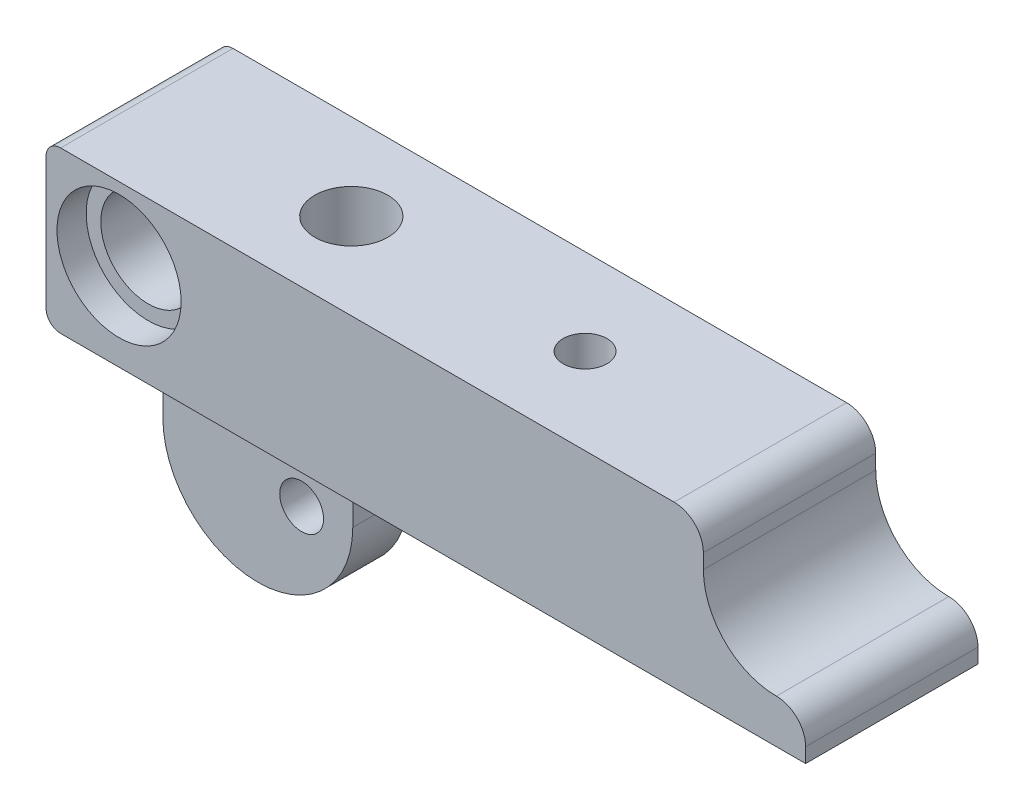
ISO-10303-21;
HEADER;
FILE_DESCRIPTION(('STEP AP214'),'2;1');
FILE_NAME('part.step','',(''),(''),'','','');
FILE_SCHEMA(('AUTOMOTIVE_DESIGN { 1 0 10303 214 1 1 1 1 }'));
ENDSEC;
DATA;
#1=APPLICATION_CONTEXT('core data for automotive mechanical design processes');
#2=APPLICATION_PROTOCOL_DEFINITION('international standard','automotive_design',2000,#1);
#3=PRODUCT_CONTEXT('',#1,'mechanical');
#4=PRODUCT('Part','Part','',(#3));
#5=PRODUCT_RELATED_PRODUCT_CATEGORY('part','',(#4));
#6=PRODUCT_DEFINITION_FORMATION('','',#4);
#7=PRODUCT_DEFINITION_CONTEXT('part definition',#1,'design');
#8=PRODUCT_DEFINITION('design','',#6,#7);
#9=PRODUCT_DEFINITION_SHAPE('','',#8);
#10=(LENGTH_UNIT() NAMED_UNIT(*) SI_UNIT(.MILLI.,.METRE.));
#11=(NAMED_UNIT(*) PLANE_ANGLE_UNIT() SI_UNIT($,.RADIAN.));
#12=(NAMED_UNIT(*) SI_UNIT($,.STERADIAN.) SOLID_ANGLE_UNIT());
#13=UNCERTAINTY_MEASURE_WITH_UNIT(LENGTH_MEASURE(1.E-05),#10,'distance_accuracy_value','');
#14=(GEOMETRIC_REPRESENTATION_CONTEXT(3) GLOBAL_UNCERTAINTY_ASSIGNED_CONTEXT((#13)) GLOBAL_UNIT_ASSIGNED_CONTEXT((#10,
#11,#12)) REPRESENTATION_CONTEXT('',''));
#15=CARTESIAN_POINT('',(0.,0.,0.));
#16=DIRECTION('',(0.,0.,1.));
#17=DIRECTION('',(1.,0.,0.));
#18=AXIS2_PLACEMENT_3D('',#15,#16,#17);
#19=CARTESIAN_POINT('',(-4.27848101265818,3.,0.));
#20=DIRECTION('',(0.,0.,1.));
#21=DIRECTION('',(1.,0.,0.));
#22=AXIS2_PLACEMENT_3D('',#19,#20,#21);
#23=CYLINDRICAL_SURFACE('',#22,3.25);
#24=CARTESIAN_POINT('',(-4.27848101265818,3.,0.));
#25=DIRECTION('',(0.,0.,1.));
#26=DIRECTION('',(1.,0.,0.));
#27=AXIS2_PLACEMENT_3D('',#24,#25,#26);
#28=CIRCLE('',#27,3.25);
#29=CARTESIAN_POINT('',(-1.02848101265818,3.,0.));
#30=VERTEX_POINT('',#29);
#31=EDGE_CURVE('E170',#30,#30,#28,.T.);
#32=ORIENTED_EDGE('',*,*,#31,.F.);
#33=EDGE_LOOP('',(#32));
#34=FACE_BOUND('',#33,.T.);
#35=CARTESIAN_POINT('',(-4.27848101265818,3.,9.8));
#36=DIRECTION('',(0.,0.,1.));
#37=DIRECTION('',(1.,0.,0.));
#38=AXIS2_PLACEMENT_3D('',#35,#36,#37);
#39=CIRCLE('',#38,3.25);
#40=CARTESIAN_POINT('',(-1.02848101265818,3.,9.8));
#41=VERTEX_POINT('',#40);
#42=EDGE_CURVE('E219',#41,#41,#39,.F.);
#43=ORIENTED_EDGE('',*,*,#42,.F.);
#44=EDGE_LOOP('',(#43));
#45=FACE_BOUND('',#44,.T.);
#46=ADVANCED_FACE('F39',(#34,#45),#23,.F.);
#47=CARTESIAN_POINT('',(-2.77848101265819,-12.5,3.8));
#48=DIRECTION('',(0.,0.,1.));
#49=DIRECTION('',(1.,0.,0.));
#50=AXIS2_PLACEMENT_3D('',#47,#48,#49);
#51=PLANE('',#50);
#52=DIRECTION('',(1.,0.,0.));
#53=VECTOR('',#52,1.);
#54=CARTESIAN_POINT('',(3.72151898734181,-3.,3.8));
#55=LINE('',#54,#53);
#56=CARTESIAN_POINT('',(-8.27848101265818,-3.,3.8));
#57=VERTEX_POINT('',#56);
#58=CARTESIAN_POINT('',(3.72151898734181,-3.,3.8));
#59=VERTEX_POINT('',#58);
#60=EDGE_CURVE('E166',#57,#59,#55,.T.);
#61=ORIENTED_EDGE('',*,*,#60,.F.);
#62=CARTESIAN_POINT('',(-8.27848101265818,-2.,3.8));
#63=DIRECTION('',(0.,0.,1.));
#64=DIRECTION('',(1.,0.,0.));
#65=AXIS2_PLACEMENT_3D('',#62,#63,#64);
#66=CIRCLE('',#65,1.);
#67=CARTESIAN_POINT('',(-9.27848101265818,-2.,3.8));
#68=VERTEX_POINT('',#67);
#69=EDGE_CURVE('E246',#57,#68,#66,.F.);
#70=ORIENTED_EDGE('',*,*,#69,.T.);
#71=DIRECTION('',(0.,-1.,0.));
#72=VECTOR('',#71,1.);
#73=CARTESIAN_POINT('',(-9.27848101265818,8.,3.8));
#74=LINE('',#73,#72);
#75=CARTESIAN_POINT('',(-9.27848101265819,-12.5,3.8));
#76=VERTEX_POINT('',#75);
#77=EDGE_CURVE('E179',#68,#76,#74,.T.);
#78=ORIENTED_EDGE('',*,*,#77,.T.);
#79=CARTESIAN_POINT('',(-2.77848101265819,-12.5,3.8));
#80=DIRECTION('',(0.,0.,1.));
#81=DIRECTION('',(1.,0.,0.));
#82=AXIS2_PLACEMENT_3D('',#79,#80,#81);
#83=CIRCLE('',#82,6.5);
#84=CARTESIAN_POINT('',(3.72151898734181,-12.5,3.8));
#85=VERTEX_POINT('',#84);
#86=EDGE_CURVE('E182',#76,#85,#83,.T.);
#87=ORIENTED_EDGE('',*,*,#86,.T.);
#88=DIRECTION('',(0.,1.,0.));
#89=VECTOR('',#88,1.);
#90=CARTESIAN_POINT('',(3.72151898734181,-12.5,3.8));
#91=LINE('',#90,#89);
#92=EDGE_CURVE('E155',#85,#59,#91,.T.);
#93=ORIENTED_EDGE('',*,*,#92,.T.);
#94=EDGE_LOOP('',(#61,#70,#78,#87,#93));
#95=FACE_BOUND('',#94,.T.);
#96=CARTESIAN_POINT('',(0.221518987341812,-13.,3.8));
#97=DIRECTION('',(0.,0.,1.));
#98=DIRECTION('',(1.,0.,0.));
#99=AXIS2_PLACEMENT_3D('',#96,#97,#98);
#100=CIRCLE('',#99,1.5);
#101=CARTESIAN_POINT('',(-1.27848101265819,-13.,3.8));
#102=VERTEX_POINT('',#101);
#103=EDGE_CURVE('E171',#102,#102,#100,.T.);
#104=ORIENTED_EDGE('',*,*,#103,.F.);
#105=EDGE_LOOP('',(#104));
#106=FACE_BOUND('',#105,.T.);
#107=ADVANCED_FACE('F362',(#95,#106),#51,.T.);
#108=CARTESIAN_POINT('',(-2.77848101265819,-12.5,0.));
#109=DIRECTION('',(0.,0.,1.));
#110=DIRECTION('',(1.,0.,0.));
#111=AXIS2_PLACEMENT_3D('',#108,#109,#110);
#112=PLANE('',#111);
#113=ORIENTED_EDGE('',*,*,#31,.T.);
#114=EDGE_LOOP('',(#113));
#115=FACE_BOUND('',#114,.T.);
#116=CARTESIAN_POINT('',(40.7215189873418,5.,0.));
#117=DIRECTION('',(0.,0.,1.));
#118=DIRECTION('',(1.,0.,0.));
#119=AXIS2_PLACEMENT_3D('',#116,#117,#118);
#120=CIRCLE('',#119,5.);
#121=CARTESIAN_POINT('',(35.7215189873418,5.,0.));
#122=VERTEX_POINT('',#121);
#123=CARTESIAN_POINT('',(40.7215189873418,0.,0.));
#124=VERTEX_POINT('',#123);
#125=EDGE_CURVE('E273',#122,#124,#120,.T.);
#126=ORIENTED_EDGE('',*,*,#125,.T.);
#127=CARTESIAN_POINT('',(40.7215189873418,-2.,0.));
#128=DIRECTION('',(0.,0.,1.));
#129=DIRECTION('',(1.,0.,0.));
#130=AXIS2_PLACEMENT_3D('',#127,#128,#129);
#131=CIRCLE('',#130,2.);
#132=CARTESIAN_POINT('',(42.7215189873418,-2.,0.));
#133=VERTEX_POINT('',#132);
#134=EDGE_CURVE('E62',#124,#133,#131,.F.);
#135=ORIENTED_EDGE('',*,*,#134,.T.);
#136=DIRECTION('',(0.,1.,0.));
#137=VECTOR('',#136,1.);
#138=CARTESIAN_POINT('',(42.7215189873418,-3.,0.));
#139=LINE('',#138,#137);
#140=CARTESIAN_POINT('',(42.7215189873418,-3.,0.));
#141=VERTEX_POINT('',#140);
#142=EDGE_CURVE('E200',#141,#133,#139,.T.);
#143=ORIENTED_EDGE('',*,*,#142,.F.);
#144=DIRECTION('',(1.,0.,0.));
#145=VECTOR('',#144,1.);
#146=CARTESIAN_POINT('',(35.7215189873418,-3.,0.));
#147=LINE('',#146,#145);
#148=CARTESIAN_POINT('',(3.72151898734181,-3.,0.));
#149=VERTEX_POINT('',#148);
#150=EDGE_CURVE('E152',#149,#141,#147,.T.);
#151=ORIENTED_EDGE('',*,*,#150,.F.);
#152=DIRECTION('',(0.,1.,0.));
#153=VECTOR('',#152,1.);
#154=CARTESIAN_POINT('',(3.72151898734181,-12.5,0.));
#155=LINE('',#154,#153);
#156=CARTESIAN_POINT('',(3.72151898734181,-12.5,0.));
#157=VERTEX_POINT('',#156);
#158=EDGE_CURVE('E194',#157,#149,#155,.T.);
#159=ORIENTED_EDGE('',*,*,#158,.F.);
#160=CARTESIAN_POINT('',(-2.77848101265819,-12.5,0.));
#161=DIRECTION('',(0.,0.,1.));
#162=DIRECTION('',(1.,0.,0.));
#163=AXIS2_PLACEMENT_3D('',#160,#161,#162);
#164=CIRCLE('',#163,6.5);
#165=CARTESIAN_POINT('',(-9.27848101265819,-12.5,0.));
#166=VERTEX_POINT('',#165);
#167=EDGE_CURVE('E191',#166,#157,#164,.T.);
#168=ORIENTED_EDGE('',*,*,#167,.F.);
#169=DIRECTION('',(0.,-1.,0.));
#170=VECTOR('',#169,1.);
#171=CARTESIAN_POINT('',(-9.27848101265818,-3.,0.));
#172=LINE('',#171,#170);
#173=CARTESIAN_POINT('',(-9.27848101265818,7.,0.));
#174=VERTEX_POINT('',#173);
#175=EDGE_CURVE('E175',#174,#166,#172,.T.);
#176=ORIENTED_EDGE('',*,*,#175,.F.);
#177=CARTESIAN_POINT('',(-8.27848101265818,7.,0.));
#178=DIRECTION('',(0.,0.,1.));
#179=DIRECTION('',(1.,0.,0.));
#180=AXIS2_PLACEMENT_3D('',#177,#178,#179);
#181=CIRCLE('',#180,1.);
#182=CARTESIAN_POINT('',(-8.27848101265818,8.,0.));
#183=VERTEX_POINT('',#182);
#184=EDGE_CURVE('E238',#174,#183,#181,.F.);
#185=ORIENTED_EDGE('',*,*,#184,.T.);
#186=DIRECTION('',(-1.,0.,0.));
#187=VECTOR('',#186,1.);
#188=CARTESIAN_POINT('',(-9.27848101265818,8.,0.));
#189=LINE('',#188,#187);
#190=CARTESIAN_POINT('',(33.7215189873418,8.,0.));
#191=VERTEX_POINT('',#190);
#192=EDGE_CURVE('E183',#191,#183,#189,.T.);
#193=ORIENTED_EDGE('',*,*,#192,.F.);
#194=CARTESIAN_POINT('',(33.7215189873418,6.,0.));
#195=DIRECTION('',(0.,0.,1.));
#196=DIRECTION('',(1.,0.,0.));
#197=AXIS2_PLACEMENT_3D('',#194,#195,#196);
#198=CIRCLE('',#197,2.);
#199=CARTESIAN_POINT('',(35.7215189873418,6.,0.));
#200=VERTEX_POINT('',#199);
#201=EDGE_CURVE('E254',#191,#200,#198,.F.);
#202=ORIENTED_EDGE('',*,*,#201,.T.);
#203=DIRECTION('',(0.,1.,0.));
#204=VECTOR('',#203,1.);
#205=CARTESIAN_POINT('',(35.7215189873418,8.,0.));
#206=LINE('',#205,#204);
#207=EDGE_CURVE('E203',#122,#200,#206,.T.);
#208=ORIENTED_EDGE('',*,*,#207,.F.);
#209=EDGE_LOOP('',(#126,#135,#143,#151,#159,#168,#176,#185,#193,#202,#208));
#210=FACE_BOUND('',#209,.T.);
#211=CARTESIAN_POINT('',(0.221518987341812,-13.,0.));
#212=DIRECTION('',(0.,0.,1.));
#213=DIRECTION('',(1.,0.,0.));
#214=AXIS2_PLACEMENT_3D('',#211,#212,#213);
#215=CIRCLE('',#214,1.5);
#216=CARTESIAN_POINT('',(-1.27848101265819,-13.,0.));
#217=VERTEX_POINT('',#216);
#218=EDGE_CURVE('E162',#217,#217,#215,.T.);
#219=ORIENTED_EDGE('',*,*,#218,.T.);
#220=EDGE_LOOP('',(#219));
#221=FACE_BOUND('',#220,.T.);
#222=ADVANCED_FACE('F292',(#115,#210,#221),#112,.F.);
#223=CARTESIAN_POINT('',(-9.27848101265818,-3.,3.8));
#224=DIRECTION('',(1.,0.,0.));
#225=DIRECTION('',(0.,1.,0.));
#226=AXIS2_PLACEMENT_3D('',#223,#224,#225);
#227=PLANE('',#226);
#228=ORIENTED_EDGE('',*,*,#77,.F.);
#229=DIRECTION('',(0.,0.,-1.));
#230=VECTOR('',#229,1.);
#231=CARTESIAN_POINT('',(-9.27848101265818,-2.,3.8));
#232=LINE('',#231,#230);
#233=CARTESIAN_POINT('',(-9.27848101265819,-2.,11.8));
#234=VERTEX_POINT('',#233);
#235=EDGE_CURVE('E230',#68,#234,#232,.F.);
#236=ORIENTED_EDGE('',*,*,#235,.T.);
#237=DIRECTION('',(0.,-1.,0.));
#238=VECTOR('',#237,1.);
#239=CARTESIAN_POINT('',(-9.27848101265818,8.,11.8));
#240=LINE('',#239,#238);
#241=CARTESIAN_POINT('',(-9.27848101265818,7.,11.8));
#242=VERTEX_POINT('',#241);
#243=EDGE_CURVE('E146',#242,#234,#240,.T.);
#244=ORIENTED_EDGE('',*,*,#243,.F.);
#245=DIRECTION('',(0.,0.,-1.));
#246=VECTOR('',#245,1.);
#247=CARTESIAN_POINT('',(-9.27848101265818,7.,3.8));
#248=LINE('',#247,#246);
#249=EDGE_CURVE('E226',#242,#174,#248,.T.);
#250=ORIENTED_EDGE('',*,*,#249,.T.);
#251=ORIENTED_EDGE('',*,*,#175,.T.);
#252=DIRECTION('',(0.,0.,-1.));
#253=VECTOR('',#252,1.);
#254=CARTESIAN_POINT('',(-9.27848101265819,-12.5,3.8));
#255=LINE('',#254,#253);
#256=EDGE_CURVE('E214',#76,#166,#255,.T.);
#257=ORIENTED_EDGE('',*,*,#256,.F.);
#258=EDGE_LOOP('',(#228,#236,#244,#250,#251,#257));
#259=FACE_BOUND('',#258,.T.);
#260=ADVANCED_FACE('F384',(#259),#227,.F.);
#261=CARTESIAN_POINT('',(-2.77848101265819,-12.5,3.8));
#262=DIRECTION('',(0.,0.,-1.));
#263=DIRECTION('',(-1.,0.,0.));
#264=AXIS2_PLACEMENT_3D('',#261,#262,#263);
#265=CYLINDRICAL_SURFACE('',#264,6.5);
#266=ORIENTED_EDGE('',*,*,#167,.T.);
#267=DIRECTION('',(0.,0.,-1.));
#268=VECTOR('',#267,1.);
#269=CARTESIAN_POINT('',(3.72151898734181,-12.5,3.8));
#270=LINE('',#269,#268);
#271=EDGE_CURVE('E210',#85,#157,#270,.T.);
#272=ORIENTED_EDGE('',*,*,#271,.F.);
#273=ORIENTED_EDGE('',*,*,#86,.F.);
#274=ORIENTED_EDGE('',*,*,#256,.T.);
#275=EDGE_LOOP('',(#266,#272,#273,#274));
#276=FACE_BOUND('',#275,.T.);
#277=ADVANCED_FACE('F358',(#276),#265,.T.);
#278=CARTESIAN_POINT('',(3.72151898734181,-12.5,3.8));
#279=DIRECTION('',(-1.,0.,0.));
#280=DIRECTION('',(0.,-1.,0.));
#281=AXIS2_PLACEMENT_3D('',#278,#279,#280);
#282=PLANE('',#281);
#283=ORIENTED_EDGE('',*,*,#158,.T.);
#284=DIRECTION('',(0.,0.,-1.));
#285=VECTOR('',#284,1.);
#286=CARTESIAN_POINT('',(3.72151898734181,-3.,3.8));
#287=LINE('',#286,#285);
#288=EDGE_CURVE('E154',#59,#149,#287,.T.);
#289=ORIENTED_EDGE('',*,*,#288,.F.);
#290=ORIENTED_EDGE('',*,*,#92,.F.);
#291=ORIENTED_EDGE('',*,*,#271,.T.);
#292=EDGE_LOOP('',(#283,#289,#290,#291));
#293=FACE_BOUND('',#292,.T.);
#294=ADVANCED_FACE('F350',(#293),#282,.F.);
#295=CARTESIAN_POINT('',(35.7215189873418,-3.,3.8));
#296=DIRECTION('',(0.,1.,0.));
#297=DIRECTION('',(0.,0.,1.));
#298=AXIS2_PLACEMENT_3D('',#295,#296,#297);
#299=PLANE('',#298);
#300=CARTESIAN_POINT('',(5.72151898734182,-3.,5.9));
#301=DIRECTION('',(0.,1.,0.));
#302=DIRECTION('',(0.,0.,1.));
#303=AXIS2_PLACEMENT_3D('',#300,#301,#302);
#304=CIRCLE('',#303,2.5);
#305=CARTESIAN_POINT('',(5.72151898734182,-3.,8.4));
#306=VERTEX_POINT('',#305);
#307=EDGE_CURVE('E314',#306,#306,#304,.T.);
#308=ORIENTED_EDGE('',*,*,#307,.T.);
#309=EDGE_LOOP('',(#308));
#310=FACE_BOUND('',#309,.T.);
#311=CARTESIAN_POINT('',(21.7215189873418,-3.,5.9));
#312=DIRECTION('',(0.,1.,0.));
#313=DIRECTION('',(0.,0.,1.));
#314=AXIS2_PLACEMENT_3D('',#311,#312,#313);
#315=CIRCLE('',#314,1.5);
#316=CARTESIAN_POINT('',(21.7215189873418,-3.,7.4));
#317=VERTEX_POINT('',#316);
#318=EDGE_CURVE('E321',#317,#317,#315,.T.);
#319=ORIENTED_EDGE('',*,*,#318,.T.);
#320=EDGE_LOOP('',(#319));
#321=FACE_BOUND('',#320,.T.);
#322=DIRECTION('',(1.,0.,0.));
#323=VECTOR('',#322,1.);
#324=CARTESIAN_POINT('',(3.72151898734181,-3.,11.8));
#325=LINE('',#324,#323);
#326=CARTESIAN_POINT('',(-8.27848101265818,-3.,11.8));
#327=VERTEX_POINT('',#326);
#328=CARTESIAN_POINT('',(42.7215189873418,-3.,11.8));
#329=VERTEX_POINT('',#328);
#330=EDGE_CURVE('E134',#327,#329,#325,.T.);
#331=ORIENTED_EDGE('',*,*,#330,.F.);
#332=DIRECTION('',(0.,0.,-1.));
#333=VECTOR('',#332,1.);
#334=CARTESIAN_POINT('',(-8.27848101265818,-3.,3.8));
#335=LINE('',#334,#333);
#336=EDGE_CURVE('E218',#327,#57,#335,.T.);
#337=ORIENTED_EDGE('',*,*,#336,.T.);
#338=ORIENTED_EDGE('',*,*,#60,.T.);
#339=ORIENTED_EDGE('',*,*,#288,.T.);
#340=ORIENTED_EDGE('',*,*,#150,.T.);
#341=DIRECTION('',(0.,0.,-1.));
#342=VECTOR('',#341,1.);
#343=CARTESIAN_POINT('',(42.7215189873418,-3.,3.8));
#344=LINE('',#343,#342);
#345=EDGE_CURVE('E149',#329,#141,#344,.T.);
#346=ORIENTED_EDGE('',*,*,#345,.F.);
#347=EDGE_LOOP('',(#331,#337,#338,#339,#340,#346));
#348=FACE_BOUND('',#347,.T.);
#349=ADVANCED_FACE('F150',(#310,#321,#348),#299,.F.);
#350=CARTESIAN_POINT('',(42.7215189873418,-3.,3.8));
#351=DIRECTION('',(-1.,0.,0.));
#352=DIRECTION('',(0.,-1.,0.));
#353=AXIS2_PLACEMENT_3D('',#350,#351,#352);
#354=PLANE('',#353);
#355=ORIENTED_EDGE('',*,*,#142,.T.);
#356=DIRECTION('',(0.,0.,-1.));
#357=VECTOR('',#356,1.);
#358=CARTESIAN_POINT('',(42.7215189873418,-2.,3.8));
#359=LINE('',#358,#357);
#360=CARTESIAN_POINT('',(42.7215189873418,-2.,11.8));
#361=VERTEX_POINT('',#360);
#362=EDGE_CURVE('E48',#133,#361,#359,.F.);
#363=ORIENTED_EDGE('',*,*,#362,.T.);
#364=DIRECTION('',(0.,1.,0.));
#365=VECTOR('',#364,1.);
#366=CARTESIAN_POINT('',(42.7215189873418,-3.,11.8));
#367=LINE('',#366,#365);
#368=EDGE_CURVE('E137',#329,#361,#367,.T.);
#369=ORIENTED_EDGE('',*,*,#368,.F.);
#370=ORIENTED_EDGE('',*,*,#345,.T.);
#371=EDGE_LOOP('',(#355,#363,#369,#370));
#372=FACE_BOUND('',#371,.T.);
#373=ADVANCED_FACE('F157',(#372),#354,.F.);
#374=CARTESIAN_POINT('',(35.7215189873418,8.,3.8));
#375=DIRECTION('',(-1.,0.,0.));
#376=DIRECTION('',(0.,0.,1.));
#377=AXIS2_PLACEMENT_3D('',#374,#375,#376);
#378=PLANE('',#377);
#379=DIRECTION('',(0.,1.,0.));
#380=VECTOR('',#379,1.);
#381=CARTESIAN_POINT('',(35.7215189873418,0.,11.8));
#382=LINE('',#381,#380);
#383=CARTESIAN_POINT('',(35.7215189873418,5.,11.8));
#384=VERTEX_POINT('',#383);
#385=CARTESIAN_POINT('',(35.7215189873418,6.,11.8));
#386=VERTEX_POINT('',#385);
#387=EDGE_CURVE('E159',#384,#386,#382,.T.);
#388=ORIENTED_EDGE('',*,*,#387,.F.);
#389=DIRECTION('',(0.,0.,-1.));
#390=VECTOR('',#389,1.);
#391=CARTESIAN_POINT('',(35.7215189873418,5.,0.));
#392=LINE('',#391,#390);
#393=EDGE_CURVE('E265',#384,#122,#392,.T.);
#394=ORIENTED_EDGE('',*,*,#393,.T.);
#395=ORIENTED_EDGE('',*,*,#207,.T.);
#396=DIRECTION('',(0.,0.,-1.));
#397=VECTOR('',#396,1.);
#398=CARTESIAN_POINT('',(35.7215189873418,6.,3.8));
#399=LINE('',#398,#397);
#400=EDGE_CURVE('E258',#200,#386,#399,.F.);
#401=ORIENTED_EDGE('',*,*,#400,.T.);
#402=EDGE_LOOP('',(#388,#394,#395,#401));
#403=FACE_BOUND('',#402,.T.);
#404=ADVANCED_FACE('F287',(#403),#378,.F.);
#405=CARTESIAN_POINT('',(-9.27848101265818,8.,3.8));
#406=DIRECTION('',(0.,-1.,0.));
#407=DIRECTION('',(1.,0.,0.));
#408=AXIS2_PLACEMENT_3D('',#405,#406,#407);
#409=PLANE('',#408);
#410=CARTESIAN_POINT('',(5.72151898734182,8.,5.9));
#411=DIRECTION('',(0.,1.,0.));
#412=DIRECTION('',(-1.,0.,0.));
#413=AXIS2_PLACEMENT_3D('',#410,#411,#412);
#414=CIRCLE('',#413,2.5);
#415=CARTESIAN_POINT('',(3.22151898734182,8.,5.9));
#416=VERTEX_POINT('',#415);
#417=EDGE_CURVE('E325',#416,#416,#414,.T.);
#418=ORIENTED_EDGE('',*,*,#417,.F.);
#419=EDGE_LOOP('',(#418));
#420=FACE_BOUND('',#419,.T.);
#421=CARTESIAN_POINT('',(21.7215189873418,8.,5.9));
#422=DIRECTION('',(0.,1.,0.));
#423=DIRECTION('',(-1.,0.,0.));
#424=AXIS2_PLACEMENT_3D('',#421,#422,#423);
#425=CIRCLE('',#424,1.5);
#426=CARTESIAN_POINT('',(20.2215189873418,8.,5.9));
#427=VERTEX_POINT('',#426);
#428=EDGE_CURVE('E326',#427,#427,#425,.T.);
#429=ORIENTED_EDGE('',*,*,#428,.F.);
#430=EDGE_LOOP('',(#429));
#431=FACE_BOUND('',#430,.T.);
#432=DIRECTION('',(-1.,0.,0.));
#433=VECTOR('',#432,1.);
#434=CARTESIAN_POINT('',(35.7215189873418,8.,11.8));
#435=LINE('',#434,#433);
#436=CARTESIAN_POINT('',(33.7215189873418,8.,11.8));
#437=VERTEX_POINT('',#436);
#438=CARTESIAN_POINT('',(-8.27848101265817,8.,11.8));
#439=VERTEX_POINT('',#438);
#440=EDGE_CURVE('E169',#437,#439,#435,.T.);
#441=ORIENTED_EDGE('',*,*,#440,.F.);
#442=DIRECTION('',(0.,0.,-1.));
#443=VECTOR('',#442,1.);
#444=CARTESIAN_POINT('',(33.7215189873418,8.,3.8));
#445=LINE('',#444,#443);
#446=EDGE_CURVE('E250',#437,#191,#445,.T.);
#447=ORIENTED_EDGE('',*,*,#446,.T.);
#448=ORIENTED_EDGE('',*,*,#192,.T.);
#449=DIRECTION('',(0.,0.,-1.));
#450=VECTOR('',#449,1.);
#451=CARTESIAN_POINT('',(-8.27848101265818,8.,3.8));
#452=LINE('',#451,#450);
#453=EDGE_CURVE('E242',#183,#439,#452,.F.);
#454=ORIENTED_EDGE('',*,*,#453,.T.);
#455=EDGE_LOOP('',(#441,#447,#448,#454));
#456=FACE_BOUND('',#455,.T.);
#457=ADVANCED_FACE('F300',(#420,#431,#456),#409,.F.);
#458=CARTESIAN_POINT('',(0.221518987341812,-13.,3.8));
#459=DIRECTION('',(0.,0.,-1.));
#460=DIRECTION('',(-1.,0.,0.));
#461=AXIS2_PLACEMENT_3D('',#458,#459,#460);
#462=CYLINDRICAL_SURFACE('',#461,1.5);
#463=CARTESIAN_POINT('',(-1.27848101265819,-13.,3.8));
#464=CARTESIAN_POINT('',(-1.27848101265819,-13.,3.76041666666667));
#465=CARTESIAN_POINT('',(-1.27848101265819,-13.,3.72083333333333));
#466=CARTESIAN_POINT('',(-1.27848101265819,-13.,3.64166666666667));
#467=CARTESIAN_POINT('',(-1.27848101265819,-13.,3.60208333333333));
#468=CARTESIAN_POINT('',(-1.27848101265819,-13.,3.52291666666667));
#469=CARTESIAN_POINT('',(-1.27848101265819,-13.,3.48333333333333));
#470=CARTESIAN_POINT('',(-1.27848101265819,-13.,3.40416666666667));
#471=CARTESIAN_POINT('',(-1.27848101265819,-13.,3.36458333333333));
#472=CARTESIAN_POINT('',(-1.27848101265819,-13.,3.28541666666667));
#473=CARTESIAN_POINT('',(-1.27848101265819,-13.,3.24583333333333));
#474=CARTESIAN_POINT('',(-1.27848101265819,-13.,3.16666666666667));
#475=CARTESIAN_POINT('',(-1.27848101265819,-13.,3.12708333333333));
#476=CARTESIAN_POINT('',(-1.27848101265819,-13.,3.04791666666667));
#477=CARTESIAN_POINT('',(-1.27848101265819,-13.,3.00833333333333));
#478=CARTESIAN_POINT('',(-1.27848101265819,-13.,2.92916666666667));
#479=CARTESIAN_POINT('',(-1.27848101265819,-13.,2.88958333333333));
#480=CARTESIAN_POINT('',(-1.27848101265819,-13.,2.81041666666667));
#481=CARTESIAN_POINT('',(-1.27848101265819,-13.,2.77083333333333));
#482=CARTESIAN_POINT('',(-1.27848101265819,-13.,2.69166666666667));
#483=CARTESIAN_POINT('',(-1.27848101265819,-13.,2.65208333333333));
#484=CARTESIAN_POINT('',(-1.27848101265819,-13.,2.57291666666667));
#485=CARTESIAN_POINT('',(-1.27848101265819,-13.,2.53333333333333));
#486=CARTESIAN_POINT('',(-1.27848101265819,-13.,2.45416666666667));
#487=CARTESIAN_POINT('',(-1.27848101265819,-13.,2.41458333333333));
#488=CARTESIAN_POINT('',(-1.27848101265819,-13.,2.33541666666667));
#489=CARTESIAN_POINT('',(-1.27848101265819,-13.,2.29583333333333));
#490=CARTESIAN_POINT('',(-1.27848101265819,-13.,2.21666666666667));
#491=CARTESIAN_POINT('',(-1.27848101265819,-13.,2.17708333333333));
#492=CARTESIAN_POINT('',(-1.27848101265819,-13.,2.09791666666667));
#493=CARTESIAN_POINT('',(-1.27848101265819,-13.,2.05833333333333));
#494=CARTESIAN_POINT('',(-1.27848101265819,-13.,1.97916666666667));
#495=CARTESIAN_POINT('',(-1.27848101265819,-13.,1.93958333333333));
#496=CARTESIAN_POINT('',(-1.27848101265819,-13.,1.86041666666667));
#497=CARTESIAN_POINT('',(-1.27848101265819,-13.,1.82083333333333));
#498=CARTESIAN_POINT('',(-1.27848101265819,-13.,1.74166666666667));
#499=CARTESIAN_POINT('',(-1.27848101265819,-13.,1.70208333333333));
#500=CARTESIAN_POINT('',(-1.27848101265819,-13.,1.62291666666667));
#501=CARTESIAN_POINT('',(-1.27848101265819,-13.,1.58333333333333));
#502=CARTESIAN_POINT('',(-1.27848101265819,-13.,1.50416666666667));
#503=CARTESIAN_POINT('',(-1.27848101265819,-13.,1.46458333333333));
#504=CARTESIAN_POINT('',(-1.27848101265819,-13.,1.38541666666667));
#505=CARTESIAN_POINT('',(-1.27848101265819,-13.,1.34583333333333));
#506=CARTESIAN_POINT('',(-1.27848101265819,-13.,1.26666666666667));
#507=CARTESIAN_POINT('',(-1.27848101265819,-13.,1.22708333333333));
#508=CARTESIAN_POINT('',(-1.27848101265819,-13.,1.14791666666667));
#509=CARTESIAN_POINT('',(-1.27848101265819,-13.,1.10833333333333));
#510=CARTESIAN_POINT('',(-1.27848101265819,-13.,1.02916666666667));
#511=CARTESIAN_POINT('',(-1.27848101265819,-13.,0.989583333333333));
#512=CARTESIAN_POINT('',(-1.27848101265819,-13.,0.910416666666667));
#513=CARTESIAN_POINT('',(-1.27848101265819,-13.,0.870833333333333));
#514=CARTESIAN_POINT('',(-1.27848101265819,-13.,0.791666666666667));
#515=CARTESIAN_POINT('',(-1.27848101265819,-13.,0.752083333333333));
#516=CARTESIAN_POINT('',(-1.27848101265819,-13.,0.672916666666667));
#517=CARTESIAN_POINT('',(-1.27848101265819,-13.,0.633333333333333));
#518=CARTESIAN_POINT('',(-1.27848101265819,-13.,0.554166666666667));
#519=CARTESIAN_POINT('',(-1.27848101265819,-13.,0.514583333333334));
#520=CARTESIAN_POINT('',(-1.27848101265819,-13.,0.435416666666667));
#521=CARTESIAN_POINT('',(-1.27848101265819,-13.,0.395833333333333));
#522=CARTESIAN_POINT('',(-1.27848101265819,-13.,0.316666666666666));
#523=CARTESIAN_POINT('',(-1.27848101265819,-13.,0.277083333333333));
#524=CARTESIAN_POINT('',(-1.27848101265819,-13.,0.197916666666667));
#525=CARTESIAN_POINT('',(-1.27848101265819,-13.,0.158333333333333));
#526=CARTESIAN_POINT('',(-1.27848101265819,-13.,0.0791666666666666));
#527=CARTESIAN_POINT('',(-1.27848101265819,-13.,0.0395833333333333));
#528=CARTESIAN_POINT('',(-1.27848101265819,-13.,0.));
#529=B_SPLINE_CURVE_WITH_KNOTS('',3,(#463,#464,#465,#466,#467,#468,#469,#470,#471,#472,#473,
#474,#475,#476,#477,#478,#479,#480,#481,#482,#483,#484,#485,#486,#487,#488,#489,#490,#491,#492,
#493,#494,#495,#496,#497,#498,#499,#500,#501,#502,#503,#504,#505,#506,#507,#508,#509,#510,#511,
#512,#513,#514,#515,#516,#517,#518,#519,#520,#521,#522,#523,#524,#525,#526,#527,#528),
.UNSPECIFIED.,.F.,.F.,(4,2,2,2,2,2,2,2,2,2,2,2,2,2,2,2,2,2,2,2,2,2,2,2,2,2,2,2,2,2,2,2,4),(0.,
0.11875,0.2375,0.35625,0.475,0.59375,0.7125,0.831249999999999,0.95,1.06875,1.1875,1.30625,1.425,
1.54375,1.6625,1.78125,1.9,2.01875,2.1375,2.25625,2.375,2.49375,2.6125,2.73125,2.85,2.96875,
3.0875,3.20625,3.325,3.44375,3.5625,3.68125,3.8),.UNSPECIFIED.);
#530=EDGE_CURVE('BSEAM339',#102,#217,#529,.T.);
#531=ORIENTED_EDGE('',*,*,#103,.T.);
#532=ORIENTED_EDGE('',*,*,#218,.F.);
#533=ORIENTED_EDGE('',*,*,#530,.T.);
#534=ORIENTED_EDGE('',*,*,#530,.F.);
#535=EDGE_LOOP('',(#531,#533,#532,#534));
#536=FACE_BOUND('',#535,.T.);
#537=ADVANCED_FACE('F339',(#536),#462,.F.);
#538=CARTESIAN_POINT('',(0.,0.,11.8));
#539=DIRECTION('',(0.,0.,1.));
#540=DIRECTION('',(1.,0.,0.));
#541=AXIS2_PLACEMENT_3D('',#538,#539,#540);
#542=PLANE('',#541);
#543=CARTESIAN_POINT('',(-4.27848101265818,3.,11.8));
#544=DIRECTION('',(0.,0.,1.));
#545=DIRECTION('',(1.,0.,0.));
#546=AXIS2_PLACEMENT_3D('',#543,#544,#545);
#547=CIRCLE('',#546,4.25);
#548=CARTESIAN_POINT('',(-0.0284810126581813,3.,11.8));
#549=VERTEX_POINT('',#548);
#550=EDGE_CURVE('E310',#549,#549,#547,.T.);
#551=ORIENTED_EDGE('',*,*,#550,.F.);
#552=EDGE_LOOP('',(#551));
#553=FACE_BOUND('',#552,.T.);
#554=ORIENTED_EDGE('',*,*,#368,.T.);
#555=CARTESIAN_POINT('',(40.7215189873418,-2.,11.8));
#556=DIRECTION('',(0.,0.,1.));
#557=DIRECTION('',(1.,0.,0.));
#558=AXIS2_PLACEMENT_3D('',#555,#556,#557);
#559=CIRCLE('',#558,2.);
#560=CARTESIAN_POINT('',(40.7215189873418,0.,11.8));
#561=VERTEX_POINT('',#560);
#562=EDGE_CURVE('E11',#361,#561,#559,.T.);
#563=ORIENTED_EDGE('',*,*,#562,.T.);
#564=CARTESIAN_POINT('',(40.7215189873418,5.,11.8));
#565=DIRECTION('',(0.,0.,1.));
#566=DIRECTION('',(1.,0.,0.));
#567=AXIS2_PLACEMENT_3D('',#564,#565,#566);
#568=CIRCLE('',#567,5.);
#569=EDGE_CURVE('E276',#561,#384,#568,.F.);
#570=ORIENTED_EDGE('',*,*,#569,.T.);
#571=ORIENTED_EDGE('',*,*,#387,.T.);
#572=CARTESIAN_POINT('',(33.7215189873418,6.,11.8));
#573=DIRECTION('',(0.,0.,1.));
#574=DIRECTION('',(1.,0.,0.));
#575=AXIS2_PLACEMENT_3D('',#572,#573,#574);
#576=CIRCLE('',#575,2.);
#577=EDGE_CURVE('E262',#386,#437,#576,.T.);
#578=ORIENTED_EDGE('',*,*,#577,.T.);
#579=ORIENTED_EDGE('',*,*,#440,.T.);
#580=CARTESIAN_POINT('',(-8.27848101265818,7.,11.8));
#581=DIRECTION('',(0.,0.,1.));
#582=DIRECTION('',(1.,0.,0.));
#583=AXIS2_PLACEMENT_3D('',#580,#581,#582);
#584=CIRCLE('',#583,1.);
#585=EDGE_CURVE('E233',#439,#242,#584,.T.);
#586=ORIENTED_EDGE('',*,*,#585,.T.);
#587=ORIENTED_EDGE('',*,*,#243,.T.);
#588=CARTESIAN_POINT('',(-8.27848101265818,-2.,11.8));
#589=DIRECTION('',(0.,0.,1.));
#590=DIRECTION('',(1.,0.,0.));
#591=AXIS2_PLACEMENT_3D('',#588,#589,#590);
#592=CIRCLE('',#591,1.);
#593=EDGE_CURVE('E141',#234,#327,#592,.T.);
#594=ORIENTED_EDGE('',*,*,#593,.T.);
#595=ORIENTED_EDGE('',*,*,#330,.T.);
#596=EDGE_LOOP('',(#554,#563,#570,#571,#578,#579,#586,#587,#594,#595));
#597=FACE_BOUND('',#596,.T.);
#598=ADVANCED_FACE('F136',(#553,#597),#542,.T.);
#599=CARTESIAN_POINT('',(-4.27848101265818,3.,9.8));
#600=DIRECTION('',(0.,0.,1.));
#601=DIRECTION('',(1.,0.,0.));
#602=AXIS2_PLACEMENT_3D('',#599,#600,#601);
#603=PLANE('',#602);
#604=CARTESIAN_POINT('',(-4.27848101265818,3.,9.8));
#605=DIRECTION('',(0.,0.,1.));
#606=DIRECTION('',(1.,0.,0.));
#607=AXIS2_PLACEMENT_3D('',#604,#605,#606);
#608=CIRCLE('',#607,4.25);
#609=CARTESIAN_POINT('',(-0.0284810126581813,3.,9.8));
#610=VERTEX_POINT('',#609);
#611=EDGE_CURVE('E223',#610,#610,#608,.T.);
#612=ORIENTED_EDGE('',*,*,#611,.T.);
#613=EDGE_LOOP('',(#612));
#614=FACE_BOUND('',#613,.T.);
#615=ORIENTED_EDGE('',*,*,#42,.T.);
#616=EDGE_LOOP('',(#615));
#617=FACE_BOUND('',#616,.T.);
#618=ADVANCED_FACE('F378',(#614,#617),#603,.T.);
#619=CARTESIAN_POINT('',(-4.27848101265818,3.,9.8));
#620=DIRECTION('',(0.,0.,1.));
#621=DIRECTION('',(1.,0.,0.));
#622=AXIS2_PLACEMENT_3D('',#619,#620,#621);
#623=CYLINDRICAL_SURFACE('',#622,4.25);
#624=ORIENTED_EDGE('',*,*,#611,.F.);
#625=EDGE_LOOP('',(#624));
#626=FACE_BOUND('',#625,.T.);
#627=ORIENTED_EDGE('',*,*,#550,.T.);
#628=EDGE_LOOP('',(#627));
#629=FACE_BOUND('',#628,.T.);
#630=ADVANCED_FACE('F374',(#626,#629),#623,.F.);
#631=CARTESIAN_POINT('',(-8.27848101265818,-2.,3.8));
#632=DIRECTION('',(0.,0.,-1.));
#633=DIRECTION('',(-1.,0.,0.));
#634=AXIS2_PLACEMENT_3D('',#631,#632,#633);
#635=CYLINDRICAL_SURFACE('',#634,1.);
#636=ORIENTED_EDGE('',*,*,#593,.F.);
#637=ORIENTED_EDGE('',*,*,#235,.F.);
#638=ORIENTED_EDGE('',*,*,#69,.F.);
#639=ORIENTED_EDGE('',*,*,#336,.F.);
#640=EDGE_LOOP('',(#636,#637,#638,#639));
#641=FACE_BOUND('',#640,.T.);
#642=ADVANCED_FACE('F422',(#641),#635,.T.);
#643=CARTESIAN_POINT('',(-8.27848101265818,7.,3.8));
#644=DIRECTION('',(0.,0.,-1.));
#645=DIRECTION('',(-1.,0.,0.));
#646=AXIS2_PLACEMENT_3D('',#643,#644,#645);
#647=CYLINDRICAL_SURFACE('',#646,1.);
#648=ORIENTED_EDGE('',*,*,#585,.F.);
#649=ORIENTED_EDGE('',*,*,#453,.F.);
#650=ORIENTED_EDGE('',*,*,#184,.F.);
#651=ORIENTED_EDGE('',*,*,#249,.F.);
#652=EDGE_LOOP('',(#648,#649,#650,#651));
#653=FACE_BOUND('',#652,.T.);
#654=ADVANCED_FACE('F430',(#653),#647,.T.);
#655=CARTESIAN_POINT('',(33.7215189873418,6.,3.8));
#656=DIRECTION('',(0.,0.,-1.));
#657=DIRECTION('',(-1.,0.,0.));
#658=AXIS2_PLACEMENT_3D('',#655,#656,#657);
#659=CYLINDRICAL_SURFACE('',#658,2.);
#660=ORIENTED_EDGE('',*,*,#577,.F.);
#661=ORIENTED_EDGE('',*,*,#400,.F.);
#662=ORIENTED_EDGE('',*,*,#201,.F.);
#663=ORIENTED_EDGE('',*,*,#446,.F.);
#664=EDGE_LOOP('',(#660,#661,#662,#663));
#665=FACE_BOUND('',#664,.T.);
#666=ADVANCED_FACE('F297',(#665),#659,.T.);
#667=CARTESIAN_POINT('',(40.7215189873418,5.,3.8));
#668=DIRECTION('',(0.,0.,1.));
#669=DIRECTION('',(1.,0.,0.));
#670=AXIS2_PLACEMENT_3D('',#667,#668,#669);
#671=CYLINDRICAL_SURFACE('',#670,5.);
#672=ORIENTED_EDGE('',*,*,#569,.F.);
#673=DIRECTION('',(0.,0.,-1.));
#674=VECTOR('',#673,1.);
#675=CARTESIAN_POINT('',(40.7215189873418,0.,11.8));
#676=LINE('',#675,#674);
#677=EDGE_CURVE('E269',#124,#561,#676,.F.);
#678=ORIENTED_EDGE('',*,*,#677,.F.);
#679=ORIENTED_EDGE('',*,*,#125,.F.);
#680=ORIENTED_EDGE('',*,*,#393,.F.);
#681=EDGE_LOOP('',(#672,#678,#679,#680));
#682=FACE_BOUND('',#681,.T.);
#683=ADVANCED_FACE('F291',(#682),#671,.F.);
#684=CARTESIAN_POINT('',(40.7215189873418,-2.,3.8));
#685=DIRECTION('',(0.,0.,-1.));
#686=DIRECTION('',(-1.,0.,0.));
#687=AXIS2_PLACEMENT_3D('',#684,#685,#686);
#688=CYLINDRICAL_SURFACE('',#687,2.);
#689=ORIENTED_EDGE('',*,*,#562,.F.);
#690=ORIENTED_EDGE('',*,*,#362,.F.);
#691=ORIENTED_EDGE('',*,*,#134,.F.);
#692=ORIENTED_EDGE('',*,*,#677,.T.);
#693=EDGE_LOOP('',(#689,#690,#691,#692));
#694=FACE_BOUND('',#693,.T.);
#695=ADVANCED_FACE('F41',(#694),#688,.T.);
#696=CARTESIAN_POINT('',(21.7215189873418,-19.,5.9));
#697=DIRECTION('',(0.,1.,0.));
#698=DIRECTION('',(-1.,0.,0.));
#699=AXIS2_PLACEMENT_3D('',#696,#697,#698);
#700=CYLINDRICAL_SURFACE('',#699,1.5);
#701=ORIENTED_EDGE('',*,*,#428,.T.);
#702=EDGE_LOOP('',(#701));
#703=FACE_BOUND('',#702,.T.);
#704=ORIENTED_EDGE('',*,*,#318,.F.);
#705=EDGE_LOOP('',(#704));
#706=FACE_BOUND('',#705,.T.);
#707=ADVANCED_FACE('F343',(#703,#706),#700,.F.);
#708=CARTESIAN_POINT('',(5.72151898734182,-19.,5.9));
#709=DIRECTION('',(0.,1.,0.));
#710=DIRECTION('',(-1.,0.,0.));
#711=AXIS2_PLACEMENT_3D('',#708,#709,#710);
#712=CYLINDRICAL_SURFACE('',#711,2.5);
#713=ORIENTED_EDGE('',*,*,#417,.T.);
#714=EDGE_LOOP('',(#713));
#715=FACE_BOUND('',#714,.T.);
#716=ORIENTED_EDGE('',*,*,#307,.F.);
#717=EDGE_LOOP('',(#716));
#718=FACE_BOUND('',#717,.T.);
#719=ADVANCED_FACE('F334',(#715,#718),#712,.F.);
#720=CLOSED_SHELL('',(#46,#107,#222,#260,#277,#294,#349,#373,#404,#457,#537,#598,#618,#630,#642,
#654,#666,#683,#695,#707,#719));
#721=MANIFOLD_SOLID_BREP('B2',#720);
#722=ADVANCED_BREP_SHAPE_REPRESENTATION('',(#18,#721),#14);
#723=SHAPE_DEFINITION_REPRESENTATION(#9,#722);
ENDSEC;
END-ISO-10303-21;
